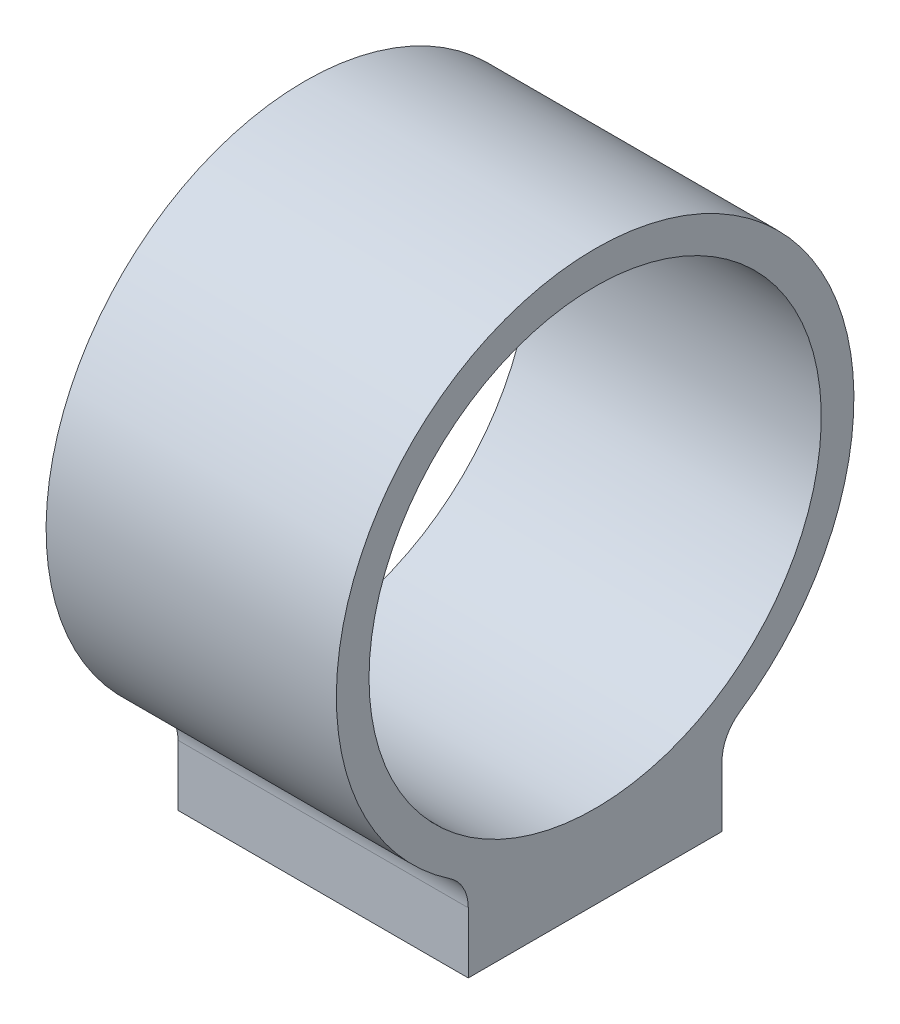
ISO-10303-21;
HEADER;
FILE_DESCRIPTION(('STEP AP214'),'2;1');
FILE_NAME('part.step','',(''),(''),'','','');
FILE_SCHEMA(('AUTOMOTIVE_DESIGN { 1 0 10303 214 1 1 1 1 }'));
ENDSEC;
DATA;
#1=APPLICATION_CONTEXT('core data for automotive mechanical design processes');
#2=APPLICATION_PROTOCOL_DEFINITION('international standard','automotive_design',2000,#1);
#3=PRODUCT_CONTEXT('',#1,'mechanical');
#4=PRODUCT('Part','Part','',(#3));
#5=PRODUCT_RELATED_PRODUCT_CATEGORY('part','',(#4));
#6=PRODUCT_DEFINITION_FORMATION('','',#4);
#7=PRODUCT_DEFINITION_CONTEXT('part definition',#1,'design');
#8=PRODUCT_DEFINITION('design','',#6,#7);
#9=PRODUCT_DEFINITION_SHAPE('','',#8);
#10=(LENGTH_UNIT() NAMED_UNIT(*) SI_UNIT(.MILLI.,.METRE.));
#11=(NAMED_UNIT(*) PLANE_ANGLE_UNIT() SI_UNIT($,.RADIAN.));
#12=(NAMED_UNIT(*) SI_UNIT($,.STERADIAN.) SOLID_ANGLE_UNIT());
#13=UNCERTAINTY_MEASURE_WITH_UNIT(LENGTH_MEASURE(1.E-05),#10,'distance_accuracy_value','');
#14=(GEOMETRIC_REPRESENTATION_CONTEXT(3) GLOBAL_UNCERTAINTY_ASSIGNED_CONTEXT((#13)) GLOBAL_UNIT_ASSIGNED_CONTEXT((#10,
#11,#12)) REPRESENTATION_CONTEXT('',''));
#15=CARTESIAN_POINT('',(0.,0.,0.));
#16=DIRECTION('',(0.,0.,1.));
#17=DIRECTION('',(1.,0.,0.));
#18=AXIS2_PLACEMENT_3D('',#15,#16,#17);
#19=CARTESIAN_POINT('',(0.,3.1,0.));
#20=DIRECTION('',(1.,0.,0.));
#21=DIRECTION('',(0.,0.,-1.));
#22=AXIS2_PLACEMENT_3D('',#19,#20,#21);
#23=PLANE('',#22);
#24=DIRECTION('',(0.,0.,1.));
#25=VECTOR('',#24,1.);
#26=CARTESIAN_POINT('',(0.,0.,0.));
#27=LINE('',#26,#25);
#28=CARTESIAN_POINT('',(0.,0.,-15.54));
#29=VERTEX_POINT('',#28);
#30=CARTESIAN_POINT('',(0.,0.,0.));
#31=VERTEX_POINT('',#30);
#32=EDGE_CURVE('E106',#29,#31,#27,.T.);
#33=ORIENTED_EDGE('',*,*,#32,.T.);
#34=DIRECTION('',(0.,-1.,0.));
#35=VECTOR('',#34,1.);
#36=CARTESIAN_POINT('',(0.,3.1,0.));
#37=LINE('',#36,#35);
#38=CARTESIAN_POINT('',(0.,3.7218681382121,0.));
#39=VERTEX_POINT('',#38);
#40=EDGE_CURVE('E91',#39,#31,#37,.T.);
#41=ORIENTED_EDGE('',*,*,#40,.F.);
#42=CARTESIAN_POINT('',(0.,3.7218681382121,2.54000000000001));
#43=DIRECTION('',(1.,0.,0.));
#44=DIRECTION('',(0.,0.,-1.));
#45=AXIS2_PLACEMENT_3D('',#42,#43,#44);
#46=CIRCLE('',#45,2.54);
#47=CARTESIAN_POINT('',(0.,5.82515551879618,1.11599782490485));
#48=VERTEX_POINT('',#47);
#49=EDGE_CURVE('E134',#39,#48,#46,.T.);
#50=ORIENTED_EDGE('',*,*,#49,.T.);
#51=CARTESIAN_POINT('',(0.,18.95,-7.77));
#52=DIRECTION('',(-1.,0.,0.));
#53=DIRECTION('',(0.,0.,1.));
#54=AXIS2_PLACEMENT_3D('',#51,#52,#53);
#55=CIRCLE('',#54,15.85);
#56=CARTESIAN_POINT('',(0.,5.82515551879617,-16.6559978249048));
#57=VERTEX_POINT('',#56);
#58=EDGE_CURVE('E147',#48,#57,#55,.T.);
#59=ORIENTED_EDGE('',*,*,#58,.T.);
#60=CARTESIAN_POINT('',(0.,3.72186813821208,-18.08));
#61=DIRECTION('',(1.,0.,0.));
#62=DIRECTION('',(0.,0.,-1.));
#63=AXIS2_PLACEMENT_3D('',#60,#61,#62);
#64=CIRCLE('',#63,2.54);
#65=CARTESIAN_POINT('',(0.,3.72186813821208,-15.54));
#66=VERTEX_POINT('',#65);
#67=EDGE_CURVE('E47',#57,#66,#64,.T.);
#68=ORIENTED_EDGE('',*,*,#67,.T.);
#69=DIRECTION('',(0.,-1.,0.));
#70=VECTOR('',#69,1.);
#71=CARTESIAN_POINT('',(0.,3.1,-15.54));
#72=LINE('',#71,#70);
#73=EDGE_CURVE('E111',#66,#29,#72,.T.);
#74=ORIENTED_EDGE('',*,*,#73,.T.);
#75=EDGE_LOOP('',(#33,#41,#50,#59,#68,#74));
#76=FACE_BOUND('',#75,.T.);
#77=CARTESIAN_POINT('',(0.,18.95,-7.77));
#78=DIRECTION('',(-1.,0.,0.));
#79=DIRECTION('',(0.,0.,1.));
#80=AXIS2_PLACEMENT_3D('',#77,#78,#79);
#81=CIRCLE('',#80,13.85);
#82=CARTESIAN_POINT('',(0.,18.95,6.08));
#83=VERTEX_POINT('',#82);
#84=EDGE_CURVE('E151',#83,#83,#81,.T.);
#85=ORIENTED_EDGE('',*,*,#84,.F.);
#86=EDGE_LOOP('',(#85));
#87=FACE_BOUND('',#86,.T.);
#88=ADVANCED_FACE('F39',(#76,#87),#23,.F.);
#89=CARTESIAN_POINT('',(0.,3.1,0.));
#90=DIRECTION('',(0.,0.,-1.));
#91=DIRECTION('',(-1.,0.,0.));
#92=AXIS2_PLACEMENT_3D('',#89,#90,#91);
#93=PLANE('',#92);
#94=DIRECTION('',(0.,-1.,0.));
#95=VECTOR('',#94,1.);
#96=CARTESIAN_POINT('',(17.78,3.1,0.));
#97=LINE('',#96,#95);
#98=CARTESIAN_POINT('',(17.78,3.7218681382121,0.));
#99=VERTEX_POINT('',#98);
#100=CARTESIAN_POINT('',(17.78,0.,0.));
#101=VERTEX_POINT('',#100);
#102=EDGE_CURVE('E100',#99,#101,#97,.T.);
#103=ORIENTED_EDGE('',*,*,#102,.F.);
#104=DIRECTION('',(-1.,0.,0.));
#105=VECTOR('',#104,1.);
#106=CARTESIAN_POINT('',(0.,3.7218681382121,0.));
#107=LINE('',#106,#105);
#108=EDGE_CURVE('E98',#99,#39,#107,.T.);
#109=ORIENTED_EDGE('',*,*,#108,.T.);
#110=ORIENTED_EDGE('',*,*,#40,.T.);
#111=DIRECTION('',(1.,0.,0.));
#112=VECTOR('',#111,1.);
#113=CARTESIAN_POINT('',(0.,0.,0.));
#114=LINE('',#113,#112);
#115=EDGE_CURVE('E95',#31,#101,#114,.T.);
#116=ORIENTED_EDGE('',*,*,#115,.T.);
#117=EDGE_LOOP('',(#103,#109,#110,#116));
#118=FACE_BOUND('',#117,.T.);
#119=ADVANCED_FACE('F94',(#118),#93,.F.);
#120=CARTESIAN_POINT('',(17.78,3.1,0.));
#121=DIRECTION('',(-1.,0.,0.));
#122=DIRECTION('',(0.,0.,1.));
#123=AXIS2_PLACEMENT_3D('',#120,#121,#122);
#124=PLANE('',#123);
#125=DIRECTION('',(0.,0.,-1.));
#126=VECTOR('',#125,1.);
#127=CARTESIAN_POINT('',(17.78,0.,0.));
#128=LINE('',#127,#126);
#129=CARTESIAN_POINT('',(17.78,0.,-15.54));
#130=VERTEX_POINT('',#129);
#131=EDGE_CURVE('E108',#101,#130,#128,.T.);
#132=ORIENTED_EDGE('',*,*,#131,.T.);
#133=DIRECTION('',(0.,-1.,0.));
#134=VECTOR('',#133,1.);
#135=CARTESIAN_POINT('',(17.78,3.1,-15.54));
#136=LINE('',#135,#134);
#137=CARTESIAN_POINT('',(17.78,3.72186813821208,-15.54));
#138=VERTEX_POINT('',#137);
#139=EDGE_CURVE('E124',#138,#130,#136,.T.);
#140=ORIENTED_EDGE('',*,*,#139,.F.);
#141=CARTESIAN_POINT('',(17.78,3.72186813821208,-18.08));
#142=DIRECTION('',(-1.,0.,0.));
#143=DIRECTION('',(0.,0.,1.));
#144=AXIS2_PLACEMENT_3D('',#141,#142,#143);
#145=CIRCLE('',#144,2.54);
#146=CARTESIAN_POINT('',(17.78,5.82515551879617,-16.6559978249048));
#147=VERTEX_POINT('',#146);
#148=EDGE_CURVE('E11',#138,#147,#145,.T.);
#149=ORIENTED_EDGE('',*,*,#148,.T.);
#150=CARTESIAN_POINT('',(17.78,18.95,-7.77));
#151=DIRECTION('',(-1.,0.,0.));
#152=DIRECTION('',(0.,0.,1.));
#153=AXIS2_PLACEMENT_3D('',#150,#151,#152);
#154=CIRCLE('',#153,15.85);
#155=CARTESIAN_POINT('',(17.78,5.82515551879619,1.11599782490485));
#156=VERTEX_POINT('',#155);
#157=EDGE_CURVE('E116',#147,#156,#154,.F.);
#158=ORIENTED_EDGE('',*,*,#157,.T.);
#159=CARTESIAN_POINT('',(17.78,3.7218681382121,2.54000000000001));
#160=DIRECTION('',(-1.,0.,0.));
#161=DIRECTION('',(0.,0.,1.));
#162=AXIS2_PLACEMENT_3D('',#159,#160,#161);
#163=CIRCLE('',#162,2.54);
#164=EDGE_CURVE('E136',#156,#99,#163,.T.);
#165=ORIENTED_EDGE('',*,*,#164,.T.);
#166=ORIENTED_EDGE('',*,*,#102,.T.);
#167=EDGE_LOOP('',(#132,#140,#149,#158,#165,#166));
#168=FACE_BOUND('',#167,.T.);
#169=CARTESIAN_POINT('',(17.78,18.95,-7.77));
#170=DIRECTION('',(-1.,0.,0.));
#171=DIRECTION('',(0.,0.,1.));
#172=AXIS2_PLACEMENT_3D('',#169,#170,#171);
#173=CIRCLE('',#172,13.85);
#174=CARTESIAN_POINT('',(17.78,18.95,6.07999999999999));
#175=VERTEX_POINT('',#174);
#176=EDGE_CURVE('E113',#175,#175,#173,.F.);
#177=ORIENTED_EDGE('',*,*,#176,.F.);
#178=EDGE_LOOP('',(#177));
#179=FACE_BOUND('',#178,.T.);
#180=ADVANCED_FACE('F140',(#168,#179),#124,.F.);
#181=CARTESIAN_POINT('',(0.,3.1,-15.54));
#182=DIRECTION('',(0.,0.,1.));
#183=DIRECTION('',(1.,0.,0.));
#184=AXIS2_PLACEMENT_3D('',#181,#182,#183);
#185=PLANE('',#184);
#186=ORIENTED_EDGE('',*,*,#73,.F.);
#187=DIRECTION('',(-1.,0.,0.));
#188=VECTOR('',#187,1.);
#189=CARTESIAN_POINT('',(0.,3.72186813821208,-15.54));
#190=LINE('',#189,#188);
#191=EDGE_CURVE('E54',#66,#138,#190,.F.);
#192=ORIENTED_EDGE('',*,*,#191,.T.);
#193=ORIENTED_EDGE('',*,*,#139,.T.);
#194=DIRECTION('',(-1.,0.,0.));
#195=VECTOR('',#194,1.);
#196=CARTESIAN_POINT('',(0.,0.,-15.54));
#197=LINE('',#196,#195);
#198=EDGE_CURVE('E121',#130,#29,#197,.T.);
#199=ORIENTED_EDGE('',*,*,#198,.T.);
#200=EDGE_LOOP('',(#186,#192,#193,#199));
#201=FACE_BOUND('',#200,.T.);
#202=ADVANCED_FACE('F180',(#201),#185,.F.);
#203=CARTESIAN_POINT('',(0.,0.,0.));
#204=DIRECTION('',(0.,-1.,0.));
#205=DIRECTION('',(0.,0.,-1.));
#206=AXIS2_PLACEMENT_3D('',#203,#204,#205);
#207=PLANE('',#206);
#208=ORIENTED_EDGE('',*,*,#32,.F.);
#209=ORIENTED_EDGE('',*,*,#198,.F.);
#210=ORIENTED_EDGE('',*,*,#131,.F.);
#211=ORIENTED_EDGE('',*,*,#115,.F.);
#212=EDGE_LOOP('',(#208,#209,#210,#211));
#213=FACE_BOUND('',#212,.T.);
#214=ADVANCED_FACE('F104',(#213),#207,.T.);
#215=CARTESIAN_POINT('',(62.6105699272271,18.95,-7.77000000000002));
#216=DIRECTION('',(-1.,0.,0.));
#217=DIRECTION('',(0.,0.,1.));
#218=AXIS2_PLACEMENT_3D('',#215,#216,#217);
#219=CYLINDRICAL_SURFACE('',#218,15.85);
#220=ORIENTED_EDGE('',*,*,#58,.F.);
#221=DIRECTION('',(-1.,0.,0.));
#222=VECTOR('',#221,1.);
#223=CARTESIAN_POINT('',(62.6105699272271,5.82515551879618,1.11599782490484));
#224=LINE('',#223,#222);
#225=EDGE_CURVE('E131',#48,#156,#224,.F.);
#226=ORIENTED_EDGE('',*,*,#225,.T.);
#227=ORIENTED_EDGE('',*,*,#157,.F.);
#228=DIRECTION('',(-1.,0.,0.));
#229=VECTOR('',#228,1.);
#230=CARTESIAN_POINT('',(62.6105699272271,5.82515551879616,-16.6559978249048));
#231=LINE('',#230,#229);
#232=EDGE_CURVE('E128',#147,#57,#231,.T.);
#233=ORIENTED_EDGE('',*,*,#232,.T.);
#234=EDGE_LOOP('',(#220,#226,#227,#233));
#235=FACE_BOUND('',#234,.T.);
#236=ADVANCED_FACE('F149',(#235),#219,.T.);
#237=CARTESIAN_POINT('',(62.6105699272271,18.95,-7.77000000000002));
#238=DIRECTION('',(-1.,0.,0.));
#239=DIRECTION('',(0.,0.,1.));
#240=AXIS2_PLACEMENT_3D('',#237,#238,#239);
#241=CYLINDRICAL_SURFACE('',#240,13.85);
#242=ORIENTED_EDGE('',*,*,#176,.T.);
#243=EDGE_LOOP('',(#242));
#244=FACE_BOUND('',#243,.T.);
#245=ORIENTED_EDGE('',*,*,#84,.T.);
#246=EDGE_LOOP('',(#245));
#247=FACE_BOUND('',#246,.T.);
#248=ADVANCED_FACE('F157',(#244,#247),#241,.F.);
#249=CARTESIAN_POINT('',(62.6105699272271,3.7218681382121,2.54));
#250=DIRECTION('',(-1.,0.,0.));
#251=DIRECTION('',(0.,0.,1.));
#252=AXIS2_PLACEMENT_3D('',#249,#250,#251);
#253=CYLINDRICAL_SURFACE('',#252,2.54);
#254=ORIENTED_EDGE('',*,*,#164,.F.);
#255=ORIENTED_EDGE('',*,*,#225,.F.);
#256=ORIENTED_EDGE('',*,*,#49,.F.);
#257=ORIENTED_EDGE('',*,*,#108,.F.);
#258=EDGE_LOOP('',(#254,#255,#256,#257));
#259=FACE_BOUND('',#258,.T.);
#260=ADVANCED_FACE('F145',(#259),#253,.F.);
#261=CARTESIAN_POINT('',(62.6105699272271,3.72186813821208,-18.08));
#262=DIRECTION('',(-1.,0.,0.));
#263=DIRECTION('',(0.,0.,1.));
#264=AXIS2_PLACEMENT_3D('',#261,#262,#263);
#265=CYLINDRICAL_SURFACE('',#264,2.54);
#266=ORIENTED_EDGE('',*,*,#148,.F.);
#267=ORIENTED_EDGE('',*,*,#191,.F.);
#268=ORIENTED_EDGE('',*,*,#67,.F.);
#269=ORIENTED_EDGE('',*,*,#232,.F.);
#270=EDGE_LOOP('',(#266,#267,#268,#269));
#271=FACE_BOUND('',#270,.T.);
#272=ADVANCED_FACE('F41',(#271),#265,.F.);
#273=CLOSED_SHELL('',(#88,#119,#180,#202,#214,#236,#248,#260,#272));
#274=MANIFOLD_SOLID_BREP('B2',#273);
#275=ADVANCED_BREP_SHAPE_REPRESENTATION('',(#18,#274),#14);
#276=SHAPE_DEFINITION_REPRESENTATION(#9,#275);
ENDSEC;
END-ISO-10303-21;
